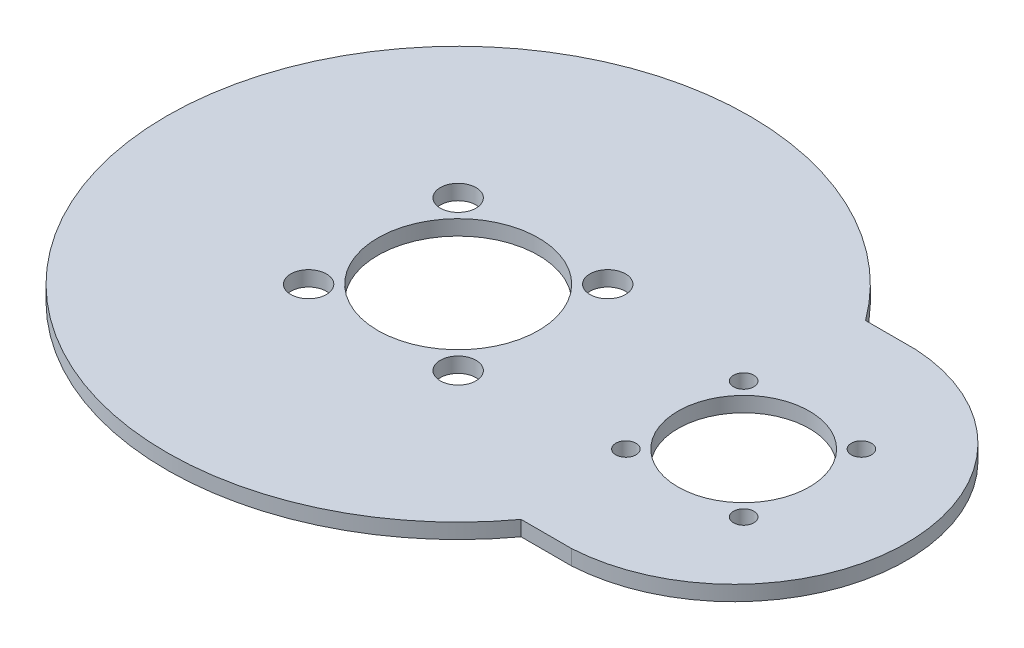
ISO-10303-21;
HEADER;
FILE_DESCRIPTION(('STEP AP214'),'2;1');
FILE_NAME('part.step','',(''),(''),'','','');
FILE_SCHEMA(('AUTOMOTIVE_DESIGN { 1 0 10303 214 1 1 1 1 }'));
ENDSEC;
DATA;
#1=APPLICATION_CONTEXT('core data for automotive mechanical design processes');
#2=APPLICATION_PROTOCOL_DEFINITION('international standard','automotive_design',2000,#1);
#3=PRODUCT_CONTEXT('',#1,'mechanical');
#4=PRODUCT('Part','Part','',(#3));
#5=PRODUCT_RELATED_PRODUCT_CATEGORY('part','',(#4));
#6=PRODUCT_DEFINITION_FORMATION('','',#4);
#7=PRODUCT_DEFINITION_CONTEXT('part definition',#1,'design');
#8=PRODUCT_DEFINITION('design','',#6,#7);
#9=PRODUCT_DEFINITION_SHAPE('','',#8);
#10=(LENGTH_UNIT() NAMED_UNIT(*) SI_UNIT(.MILLI.,.METRE.));
#11=(NAMED_UNIT(*) PLANE_ANGLE_UNIT() SI_UNIT($,.RADIAN.));
#12=(NAMED_UNIT(*) SI_UNIT($,.STERADIAN.) SOLID_ANGLE_UNIT());
#13=UNCERTAINTY_MEASURE_WITH_UNIT(LENGTH_MEASURE(1.E-05),#10,'distance_accuracy_value','');
#14=(GEOMETRIC_REPRESENTATION_CONTEXT(3) GLOBAL_UNCERTAINTY_ASSIGNED_CONTEXT((#13)) GLOBAL_UNIT_ASSIGNED_CONTEXT((#10,
#11,#12)) REPRESENTATION_CONTEXT('',''));
#15=CARTESIAN_POINT('',(0.,0.,0.));
#16=DIRECTION('',(0.,0.,1.));
#17=DIRECTION('',(1.,0.,0.));
#18=AXIS2_PLACEMENT_3D('',#15,#16,#17);
#19=CARTESIAN_POINT('',(0.,2.54,0.));
#20=DIRECTION('',(0.,-1.,0.));
#21=DIRECTION('',(0.,0.,-1.));
#22=AXIS2_PLACEMENT_3D('',#19,#20,#21);
#23=CYLINDRICAL_SURFACE('',#22,49.);
#24=CARTESIAN_POINT('',(0.,0.,0.));
#25=DIRECTION('',(0.,1.,0.));
#26=DIRECTION('',(0.,0.,1.));
#27=AXIS2_PLACEMENT_3D('',#24,#25,#26);
#28=CIRCLE('',#27,49.);
#29=CARTESIAN_POINT('',(39.5298227224412,0.,28.9550188314975));
#30=VERTEX_POINT('',#29);
#31=CARTESIAN_POINT('',(39.5298227224412,0.,-28.9550188314975));
#32=VERTEX_POINT('',#31);
#33=EDGE_CURVE('E135',#30,#32,#28,.F.);
#34=ORIENTED_EDGE('',*,*,#33,.F.);
#35=DIRECTION('',(0.,-1.,0.));
#36=VECTOR('',#35,1.);
#37=CARTESIAN_POINT('',(39.5298227224412,2.54,28.9550188314975));
#38=LINE('',#37,#36);
#39=CARTESIAN_POINT('',(39.5298227224412,2.54,28.9550188314975));
#40=VERTEX_POINT('',#39);
#41=EDGE_CURVE('E11',#40,#30,#38,.T.);
#42=ORIENTED_EDGE('',*,*,#41,.F.);
#43=CARTESIAN_POINT('',(0.,2.54,0.));
#44=DIRECTION('',(0.,1.,0.));
#45=DIRECTION('',(0.,0.,1.));
#46=AXIS2_PLACEMENT_3D('',#43,#44,#45);
#47=CIRCLE('',#46,49.);
#48=CARTESIAN_POINT('',(39.5298227224412,2.54,-28.9550188314975));
#49=VERTEX_POINT('',#48);
#50=EDGE_CURVE('E90',#40,#49,#47,.F.);
#51=ORIENTED_EDGE('',*,*,#50,.T.);
#52=DIRECTION('',(0.,-1.,0.));
#53=VECTOR('',#52,1.);
#54=CARTESIAN_POINT('',(39.5298227224412,2.54,-28.9550188314975));
#55=LINE('',#54,#53);
#56=EDGE_CURVE('E57',#49,#32,#55,.T.);
#57=ORIENTED_EDGE('',*,*,#56,.T.);
#58=EDGE_LOOP('',(#34,#42,#51,#57));
#59=FACE_BOUND('',#58,.T.);
#60=ADVANCED_FACE('F41',(#59),#23,.T.);
#61=CARTESIAN_POINT('',(0.,2.54,28.9550188314975));
#62=DIRECTION('',(0.,0.,-1.));
#63=DIRECTION('',(-1.,0.,0.));
#64=AXIS2_PLACEMENT_3D('',#61,#62,#63);
#65=PLANE('',#64);
#66=DIRECTION('',(1.,0.,0.));
#67=VECTOR('',#66,1.);
#68=CARTESIAN_POINT('',(0.,0.,28.9550188314975));
#69=LINE('',#68,#67);
#70=CARTESIAN_POINT('',(48.,0.,28.9550188314975));
#71=VERTEX_POINT('',#70);
#72=EDGE_CURVE('E96',#30,#71,#69,.T.);
#73=ORIENTED_EDGE('',*,*,#72,.T.);
#74=DIRECTION('',(0.,-1.,0.));
#75=VECTOR('',#74,1.);
#76=CARTESIAN_POINT('',(48.,2.54,28.9550188314975));
#77=LINE('',#76,#75);
#78=CARTESIAN_POINT('',(48.,2.54,28.9550188314975));
#79=VERTEX_POINT('',#78);
#80=EDGE_CURVE('E49',#79,#71,#77,.T.);
#81=ORIENTED_EDGE('',*,*,#80,.F.);
#82=DIRECTION('',(1.,0.,0.));
#83=VECTOR('',#82,1.);
#84=CARTESIAN_POINT('',(0.,2.54,28.9550188314975));
#85=LINE('',#84,#83);
#86=EDGE_CURVE('E83',#40,#79,#85,.T.);
#87=ORIENTED_EDGE('',*,*,#86,.F.);
#88=ORIENTED_EDGE('',*,*,#41,.T.);
#89=EDGE_LOOP('',(#73,#81,#87,#88));
#90=FACE_BOUND('',#89,.T.);
#91=ADVANCED_FACE('F94',(#90),#65,.F.);
#92=CARTESIAN_POINT('',(46.3854150788439,2.54,0.));
#93=DIRECTION('',(0.,-1.,0.));
#94=DIRECTION('',(0.,0.,-1.));
#95=AXIS2_PLACEMENT_3D('',#92,#93,#94);
#96=CYLINDRICAL_SURFACE('',#95,29.);
#97=CARTESIAN_POINT('',(46.3854150788439,0.,0.));
#98=DIRECTION('',(0.,1.,0.));
#99=DIRECTION('',(0.,0.,1.));
#100=AXIS2_PLACEMENT_3D('',#97,#98,#99);
#101=CIRCLE('',#100,29.);
#102=CARTESIAN_POINT('',(48.,0.,-28.9550188314975));
#103=VERTEX_POINT('',#102);
#104=EDGE_CURVE('E138',#103,#71,#101,.F.);
#105=ORIENTED_EDGE('',*,*,#104,.F.);
#106=DIRECTION('',(0.,-1.,0.));
#107=VECTOR('',#106,1.);
#108=CARTESIAN_POINT('',(48.,2.54,-28.9550188314975));
#109=LINE('',#108,#107);
#110=CARTESIAN_POINT('',(48.,2.54,-28.9550188314975));
#111=VERTEX_POINT('',#110);
#112=EDGE_CURVE('E70',#111,#103,#109,.T.);
#113=ORIENTED_EDGE('',*,*,#112,.F.);
#114=CARTESIAN_POINT('',(46.3854150788439,2.54,0.));
#115=DIRECTION('',(0.,1.,0.));
#116=DIRECTION('',(0.,0.,1.));
#117=AXIS2_PLACEMENT_3D('',#114,#115,#116);
#118=CIRCLE('',#117,29.);
#119=EDGE_CURVE('E89',#111,#79,#118,.F.);
#120=ORIENTED_EDGE('',*,*,#119,.T.);
#121=ORIENTED_EDGE('',*,*,#80,.T.);
#122=EDGE_LOOP('',(#105,#113,#120,#121));
#123=FACE_BOUND('',#122,.T.);
#124=ADVANCED_FACE('F99',(#123),#96,.T.);
#125=CARTESIAN_POINT('',(-12.5723585694968,2.54,-12.5723585694968));
#126=DIRECTION('',(0.,-1.,0.));
#127=DIRECTION('',(0.,0.,-1.));
#128=AXIS2_PLACEMENT_3D('',#125,#126,#127);
#129=CYLINDRICAL_SURFACE('',#128,3.);
#130=CARTESIAN_POINT('',(-12.5723585694968,2.54,-12.5723585694968));
#131=DIRECTION('',(0.,1.,0.));
#132=DIRECTION('',(0.,0.,1.));
#133=AXIS2_PLACEMENT_3D('',#130,#131,#132);
#134=CIRCLE('',#133,3.);
#135=CARTESIAN_POINT('',(-12.5723585694968,2.54,-9.57235856949679));
#136=VERTEX_POINT('',#135);
#137=EDGE_CURVE('E129',#136,#136,#134,.T.);
#138=ORIENTED_EDGE('',*,*,#137,.T.);
#139=EDGE_LOOP('',(#138));
#140=FACE_BOUND('',#139,.T.);
#141=CARTESIAN_POINT('',(-12.5723585694968,0.,-12.5723585694968));
#142=DIRECTION('',(0.,1.,0.));
#143=DIRECTION('',(0.,0.,1.));
#144=AXIS2_PLACEMENT_3D('',#141,#142,#143);
#145=CIRCLE('',#144,3.);
#146=CARTESIAN_POINT('',(-12.5723585694968,0.,-9.57235856949679));
#147=VERTEX_POINT('',#146);
#148=EDGE_CURVE('E167',#147,#147,#145,.T.);
#149=ORIENTED_EDGE('',*,*,#148,.F.);
#150=EDGE_LOOP('',(#149));
#151=FACE_BOUND('',#150,.T.);
#152=ADVANCED_FACE('F198',(#140,#151),#129,.F.);
#153=CARTESIAN_POINT('',(12.5723585694968,2.54,-12.5723585694968));
#154=DIRECTION('',(0.,-1.,0.));
#155=DIRECTION('',(0.,0.,-1.));
#156=AXIS2_PLACEMENT_3D('',#153,#154,#155);
#157=CYLINDRICAL_SURFACE('',#156,3.);
#158=CARTESIAN_POINT('',(12.5723585694968,2.54,-12.5723585694968));
#159=DIRECTION('',(0.,1.,0.));
#160=DIRECTION('',(0.,0.,1.));
#161=AXIS2_PLACEMENT_3D('',#158,#159,#160);
#162=CIRCLE('',#161,3.);
#163=CARTESIAN_POINT('',(12.5723585694968,2.54,-9.57235856949679));
#164=VERTEX_POINT('',#163);
#165=EDGE_CURVE('E126',#164,#164,#162,.T.);
#166=ORIENTED_EDGE('',*,*,#165,.T.);
#167=EDGE_LOOP('',(#166));
#168=FACE_BOUND('',#167,.T.);
#169=CARTESIAN_POINT('',(12.5723585694968,0.,-12.5723585694968));
#170=DIRECTION('',(0.,1.,0.));
#171=DIRECTION('',(0.,0.,1.));
#172=AXIS2_PLACEMENT_3D('',#169,#170,#171);
#173=CIRCLE('',#172,3.);
#174=CARTESIAN_POINT('',(12.5723585694968,0.,-9.57235856949679));
#175=VERTEX_POINT('',#174);
#176=EDGE_CURVE('E164',#175,#175,#173,.T.);
#177=ORIENTED_EDGE('',*,*,#176,.F.);
#178=EDGE_LOOP('',(#177));
#179=FACE_BOUND('',#178,.T.);
#180=ADVANCED_FACE('F202',(#168,#179),#157,.F.);
#181=CARTESIAN_POINT('',(12.5723585694967,2.54,12.5723585694969));
#182=DIRECTION('',(0.,-1.,0.));
#183=DIRECTION('',(0.,0.,-1.));
#184=AXIS2_PLACEMENT_3D('',#181,#182,#183);
#185=CYLINDRICAL_SURFACE('',#184,3.);
#186=CARTESIAN_POINT('',(12.5723585694967,2.54,12.5723585694969));
#187=DIRECTION('',(0.,1.,0.));
#188=DIRECTION('',(0.,0.,1.));
#189=AXIS2_PLACEMENT_3D('',#186,#187,#188);
#190=CIRCLE('',#189,3.);
#191=CARTESIAN_POINT('',(12.5723585694967,2.54,15.5723585694969));
#192=VERTEX_POINT('',#191);
#193=EDGE_CURVE('E123',#192,#192,#190,.T.);
#194=ORIENTED_EDGE('',*,*,#193,.T.);
#195=EDGE_LOOP('',(#194));
#196=FACE_BOUND('',#195,.T.);
#197=CARTESIAN_POINT('',(12.5723585694967,0.,12.5723585694969));
#198=DIRECTION('',(0.,1.,0.));
#199=DIRECTION('',(0.,0.,1.));
#200=AXIS2_PLACEMENT_3D('',#197,#198,#199);
#201=CIRCLE('',#200,3.);
#202=CARTESIAN_POINT('',(12.5723585694967,0.,15.5723585694969));
#203=VERTEX_POINT('',#202);
#204=EDGE_CURVE('E161',#203,#203,#201,.T.);
#205=ORIENTED_EDGE('',*,*,#204,.F.);
#206=EDGE_LOOP('',(#205));
#207=FACE_BOUND('',#206,.T.);
#208=ADVANCED_FACE('F208',(#196,#207),#185,.F.);
#209=CARTESIAN_POINT('',(-12.5723585694969,2.54,12.5723585694967));
#210=DIRECTION('',(0.,-1.,0.));
#211=DIRECTION('',(0.,0.,-1.));
#212=AXIS2_PLACEMENT_3D('',#209,#210,#211);
#213=CYLINDRICAL_SURFACE('',#212,3.);
#214=CARTESIAN_POINT('',(-12.5723585694969,2.54,12.5723585694967));
#215=DIRECTION('',(0.,1.,0.));
#216=DIRECTION('',(0.,0.,1.));
#217=AXIS2_PLACEMENT_3D('',#214,#215,#216);
#218=CIRCLE('',#217,3.);
#219=CARTESIAN_POINT('',(-12.5723585694969,2.54,15.5723585694967));
#220=VERTEX_POINT('',#219);
#221=EDGE_CURVE('E120',#220,#220,#218,.T.);
#222=ORIENTED_EDGE('',*,*,#221,.T.);
#223=EDGE_LOOP('',(#222));
#224=FACE_BOUND('',#223,.T.);
#225=CARTESIAN_POINT('',(-12.5723585694969,0.,12.5723585694967));
#226=DIRECTION('',(0.,1.,0.));
#227=DIRECTION('',(0.,0.,1.));
#228=AXIS2_PLACEMENT_3D('',#225,#226,#227);
#229=CIRCLE('',#228,3.);
#230=CARTESIAN_POINT('',(-12.5723585694969,0.,15.5723585694967));
#231=VERTEX_POINT('',#230);
#232=EDGE_CURVE('E158',#231,#231,#229,.T.);
#233=ORIENTED_EDGE('',*,*,#232,.F.);
#234=EDGE_LOOP('',(#233));
#235=FACE_BOUND('',#234,.T.);
#236=ADVANCED_FACE('F216',(#224,#235),#213,.F.);
#237=CARTESIAN_POINT('',(0.,2.54,0.));
#238=DIRECTION('',(0.,-1.,0.));
#239=DIRECTION('',(0.,0.,-1.));
#240=AXIS2_PLACEMENT_3D('',#237,#238,#239);
#241=CYLINDRICAL_SURFACE('',#240,13.5);
#242=CARTESIAN_POINT('',(0.,2.54,0.));
#243=DIRECTION('',(0.,1.,0.));
#244=DIRECTION('',(0.,0.,1.));
#245=AXIS2_PLACEMENT_3D('',#242,#243,#244);
#246=CIRCLE('',#245,13.5);
#247=CARTESIAN_POINT('',(0.,2.54,13.5));
#248=VERTEX_POINT('',#247);
#249=EDGE_CURVE('E117',#248,#248,#246,.T.);
#250=ORIENTED_EDGE('',*,*,#249,.T.);
#251=EDGE_LOOP('',(#250));
#252=FACE_BOUND('',#251,.T.);
#253=CARTESIAN_POINT('',(0.,0.,0.));
#254=DIRECTION('',(0.,1.,0.));
#255=DIRECTION('',(0.,0.,1.));
#256=AXIS2_PLACEMENT_3D('',#253,#254,#255);
#257=CIRCLE('',#256,13.5);
#258=CARTESIAN_POINT('',(0.,0.,13.5));
#259=VERTEX_POINT('',#258);
#260=EDGE_CURVE('E155',#259,#259,#257,.T.);
#261=ORIENTED_EDGE('',*,*,#260,.F.);
#262=EDGE_LOOP('',(#261));
#263=FACE_BOUND('',#262,.T.);
#264=ADVANCED_FACE('F220',(#252,#263),#241,.F.);
#265=CARTESIAN_POINT('',(38.1005050633883,2.54,-9.89949493661165));
#266=DIRECTION('',(0.,-1.,0.));
#267=DIRECTION('',(0.,0.,-1.));
#268=AXIS2_PLACEMENT_3D('',#265,#266,#267);
#269=CYLINDRICAL_SURFACE('',#268,1.7);
#270=CARTESIAN_POINT('',(38.1005050633883,2.54,-9.89949493661165));
#271=DIRECTION('',(0.,1.,0.));
#272=DIRECTION('',(0.,0.,1.));
#273=AXIS2_PLACEMENT_3D('',#270,#271,#272);
#274=CIRCLE('',#273,1.7);
#275=CARTESIAN_POINT('',(38.1005050633883,2.54,-8.19949493661165));
#276=VERTEX_POINT('',#275);
#277=EDGE_CURVE('E114',#276,#276,#274,.T.);
#278=ORIENTED_EDGE('',*,*,#277,.T.);
#279=EDGE_LOOP('',(#278));
#280=FACE_BOUND('',#279,.T.);
#281=CARTESIAN_POINT('',(38.1005050633883,0.,-9.89949493661165));
#282=DIRECTION('',(0.,1.,0.));
#283=DIRECTION('',(0.,0.,1.));
#284=AXIS2_PLACEMENT_3D('',#281,#282,#283);
#285=CIRCLE('',#284,1.7);
#286=CARTESIAN_POINT('',(38.1005050633883,0.,-8.19949493661165));
#287=VERTEX_POINT('',#286);
#288=EDGE_CURVE('E152',#287,#287,#285,.T.);
#289=ORIENTED_EDGE('',*,*,#288,.F.);
#290=EDGE_LOOP('',(#289));
#291=FACE_BOUND('',#290,.T.);
#292=ADVANCED_FACE('F224',(#280,#291),#269,.F.);
#293=CARTESIAN_POINT('',(57.8994949366117,2.54,-9.89949493661192));
#294=DIRECTION('',(0.,-1.,0.));
#295=DIRECTION('',(0.,0.,-1.));
#296=AXIS2_PLACEMENT_3D('',#293,#294,#295);
#297=CYLINDRICAL_SURFACE('',#296,1.7);
#298=CARTESIAN_POINT('',(57.8994949366117,2.54,-9.89949493661192));
#299=DIRECTION('',(0.,1.,0.));
#300=DIRECTION('',(0.,0.,1.));
#301=AXIS2_PLACEMENT_3D('',#298,#299,#300);
#302=CIRCLE('',#301,1.7);
#303=CARTESIAN_POINT('',(57.8994949366117,2.54,-8.19949493661193));
#304=VERTEX_POINT('',#303);
#305=EDGE_CURVE('E111',#304,#304,#302,.T.);
#306=ORIENTED_EDGE('',*,*,#305,.T.);
#307=EDGE_LOOP('',(#306));
#308=FACE_BOUND('',#307,.T.);
#309=CARTESIAN_POINT('',(57.8994949366117,0.,-9.89949493661192));
#310=DIRECTION('',(0.,1.,0.));
#311=DIRECTION('',(0.,0.,1.));
#312=AXIS2_PLACEMENT_3D('',#309,#310,#311);
#313=CIRCLE('',#312,1.7);
#314=CARTESIAN_POINT('',(57.8994949366117,0.,-8.19949493661193));
#315=VERTEX_POINT('',#314);
#316=EDGE_CURVE('E149',#315,#315,#313,.T.);
#317=ORIENTED_EDGE('',*,*,#316,.F.);
#318=EDGE_LOOP('',(#317));
#319=FACE_BOUND('',#318,.T.);
#320=ADVANCED_FACE('F228',(#308,#319),#297,.F.);
#321=CARTESIAN_POINT('',(57.8994949366119,2.54,9.89949493661144));
#322=DIRECTION('',(0.,-1.,0.));
#323=DIRECTION('',(0.,0.,-1.));
#324=AXIS2_PLACEMENT_3D('',#321,#322,#323);
#325=CYLINDRICAL_SURFACE('',#324,1.7);
#326=CARTESIAN_POINT('',(57.8994949366119,2.54,9.89949493661144));
#327=DIRECTION('',(0.,1.,0.));
#328=DIRECTION('',(0.,0.,1.));
#329=AXIS2_PLACEMENT_3D('',#326,#327,#328);
#330=CIRCLE('',#329,1.7);
#331=CARTESIAN_POINT('',(57.8994949366119,2.54,11.5994949366114));
#332=VERTEX_POINT('',#331);
#333=EDGE_CURVE('E108',#332,#332,#330,.T.);
#334=ORIENTED_EDGE('',*,*,#333,.T.);
#335=EDGE_LOOP('',(#334));
#336=FACE_BOUND('',#335,.T.);
#337=CARTESIAN_POINT('',(57.8994949366119,0.,9.89949493661144));
#338=DIRECTION('',(0.,1.,0.));
#339=DIRECTION('',(0.,0.,1.));
#340=AXIS2_PLACEMENT_3D('',#337,#338,#339);
#341=CIRCLE('',#340,1.7);
#342=CARTESIAN_POINT('',(57.8994949366119,0.,11.5994949366114));
#343=VERTEX_POINT('',#342);
#344=EDGE_CURVE('E146',#343,#343,#341,.T.);
#345=ORIENTED_EDGE('',*,*,#344,.F.);
#346=EDGE_LOOP('',(#345));
#347=FACE_BOUND('',#346,.T.);
#348=ADVANCED_FACE('F187',(#336,#347),#325,.F.);
#349=CARTESIAN_POINT('',(38.1005050633885,2.54,9.89949493661158));
#350=DIRECTION('',(0.,-1.,0.));
#351=DIRECTION('',(0.,0.,-1.));
#352=AXIS2_PLACEMENT_3D('',#349,#350,#351);
#353=CYLINDRICAL_SURFACE('',#352,1.7);
#354=CARTESIAN_POINT('',(38.1005050633885,2.54,9.89949493661158));
#355=DIRECTION('',(0.,1.,0.));
#356=DIRECTION('',(0.,0.,1.));
#357=AXIS2_PLACEMENT_3D('',#354,#355,#356);
#358=CIRCLE('',#357,1.7);
#359=CARTESIAN_POINT('',(38.1005050633885,2.54,11.5994949366116));
#360=VERTEX_POINT('',#359);
#361=EDGE_CURVE('E102',#360,#360,#358,.T.);
#362=ORIENTED_EDGE('',*,*,#361,.T.);
#363=EDGE_LOOP('',(#362));
#364=FACE_BOUND('',#363,.T.);
#365=CARTESIAN_POINT('',(38.1005050633885,0.,9.89949493661158));
#366=DIRECTION('',(0.,1.,0.));
#367=DIRECTION('',(0.,0.,1.));
#368=AXIS2_PLACEMENT_3D('',#365,#366,#367);
#369=CIRCLE('',#368,1.7);
#370=CARTESIAN_POINT('',(38.1005050633885,0.,11.5994949366116));
#371=VERTEX_POINT('',#370);
#372=EDGE_CURVE('E143',#371,#371,#369,.T.);
#373=ORIENTED_EDGE('',*,*,#372,.F.);
#374=EDGE_LOOP('',(#373));
#375=FACE_BOUND('',#374,.T.);
#376=ADVANCED_FACE('F179',(#364,#375),#353,.F.);
#377=CARTESIAN_POINT('',(0.,2.54,-28.9550188314975));
#378=DIRECTION('',(0.,0.,-1.));
#379=DIRECTION('',(-1.,0.,0.));
#380=AXIS2_PLACEMENT_3D('',#377,#378,#379);
#381=PLANE('',#380);
#382=DIRECTION('',(1.,0.,0.));
#383=VECTOR('',#382,1.);
#384=CARTESIAN_POINT('',(0.,0.,-28.9550188314975));
#385=LINE('',#384,#383);
#386=EDGE_CURVE('E140',#32,#103,#385,.T.);
#387=ORIENTED_EDGE('',*,*,#386,.F.);
#388=ORIENTED_EDGE('',*,*,#56,.F.);
#389=DIRECTION('',(1.,0.,0.));
#390=VECTOR('',#389,1.);
#391=CARTESIAN_POINT('',(0.,2.54,-28.9550188314975));
#392=LINE('',#391,#390);
#393=EDGE_CURVE('E100',#49,#111,#392,.T.);
#394=ORIENTED_EDGE('',*,*,#393,.T.);
#395=ORIENTED_EDGE('',*,*,#112,.T.);
#396=EDGE_LOOP('',(#387,#388,#394,#395));
#397=FACE_BOUND('',#396,.T.);
#398=ADVANCED_FACE('F176',(#397),#381,.T.);
#399=CARTESIAN_POINT('',(48.,2.54,0.));
#400=DIRECTION('',(0.,-1.,0.));
#401=DIRECTION('',(0.,0.,-1.));
#402=AXIS2_PLACEMENT_3D('',#399,#400,#401);
#403=CYLINDRICAL_SURFACE('',#402,11.05);
#404=CARTESIAN_POINT('',(48.,2.54,0.));
#405=DIRECTION('',(0.,1.,0.));
#406=DIRECTION('',(0.,0.,1.));
#407=AXIS2_PLACEMENT_3D('',#404,#405,#406);
#408=CIRCLE('',#407,11.05);
#409=CARTESIAN_POINT('',(48.,2.54,11.05));
#410=VERTEX_POINT('',#409);
#411=EDGE_CURVE('E132',#410,#410,#408,.T.);
#412=ORIENTED_EDGE('',*,*,#411,.T.);
#413=EDGE_LOOP('',(#412));
#414=FACE_BOUND('',#413,.T.);
#415=CARTESIAN_POINT('',(48.,0.,0.));
#416=DIRECTION('',(0.,1.,0.));
#417=DIRECTION('',(0.,0.,1.));
#418=AXIS2_PLACEMENT_3D('',#415,#416,#417);
#419=CIRCLE('',#418,11.05);
#420=CARTESIAN_POINT('',(48.,0.,11.05));
#421=VERTEX_POINT('',#420);
#422=EDGE_CURVE('E170',#421,#421,#419,.T.);
#423=ORIENTED_EDGE('',*,*,#422,.F.);
#424=EDGE_LOOP('',(#423));
#425=FACE_BOUND('',#424,.T.);
#426=ADVANCED_FACE('F178',(#414,#425),#403,.F.);
#427=CARTESIAN_POINT('',(0.,2.54,0.));
#428=DIRECTION('',(0.,1.,0.));
#429=DIRECTION('',(0.,0.,1.));
#430=AXIS2_PLACEMENT_3D('',#427,#428,#429);
#431=PLANE('',#430);
#432=ORIENTED_EDGE('',*,*,#50,.F.);
#433=ORIENTED_EDGE('',*,*,#86,.T.);
#434=ORIENTED_EDGE('',*,*,#119,.F.);
#435=ORIENTED_EDGE('',*,*,#393,.F.);
#436=EDGE_LOOP('',(#432,#433,#434,#435));
#437=FACE_BOUND('',#436,.T.);
#438=ORIENTED_EDGE('',*,*,#361,.F.);
#439=EDGE_LOOP('',(#438));
#440=FACE_BOUND('',#439,.T.);
#441=ORIENTED_EDGE('',*,*,#333,.F.);
#442=EDGE_LOOP('',(#441));
#443=FACE_BOUND('',#442,.T.);
#444=ORIENTED_EDGE('',*,*,#305,.F.);
#445=EDGE_LOOP('',(#444));
#446=FACE_BOUND('',#445,.T.);
#447=ORIENTED_EDGE('',*,*,#277,.F.);
#448=EDGE_LOOP('',(#447));
#449=FACE_BOUND('',#448,.T.);
#450=ORIENTED_EDGE('',*,*,#249,.F.);
#451=EDGE_LOOP('',(#450));
#452=FACE_BOUND('',#451,.T.);
#453=ORIENTED_EDGE('',*,*,#221,.F.);
#454=EDGE_LOOP('',(#453));
#455=FACE_BOUND('',#454,.T.);
#456=ORIENTED_EDGE('',*,*,#193,.F.);
#457=EDGE_LOOP('',(#456));
#458=FACE_BOUND('',#457,.T.);
#459=ORIENTED_EDGE('',*,*,#165,.F.);
#460=EDGE_LOOP('',(#459));
#461=FACE_BOUND('',#460,.T.);
#462=ORIENTED_EDGE('',*,*,#137,.F.);
#463=EDGE_LOOP('',(#462));
#464=FACE_BOUND('',#463,.T.);
#465=ORIENTED_EDGE('',*,*,#411,.F.);
#466=EDGE_LOOP('',(#465));
#467=FACE_BOUND('',#466,.T.);
#468=ADVANCED_FACE('F85',(#437,#440,#443,#446,#449,#452,#455,#458,#461,#464,#467),#431,.T.);
#469=CARTESIAN_POINT('',(0.,0.,0.));
#470=DIRECTION('',(0.,1.,0.));
#471=DIRECTION('',(0.,0.,1.));
#472=AXIS2_PLACEMENT_3D('',#469,#470,#471);
#473=PLANE('',#472);
#474=ORIENTED_EDGE('',*,*,#33,.T.);
#475=ORIENTED_EDGE('',*,*,#386,.T.);
#476=ORIENTED_EDGE('',*,*,#104,.T.);
#477=ORIENTED_EDGE('',*,*,#72,.F.);
#478=EDGE_LOOP('',(#474,#475,#476,#477));
#479=FACE_BOUND('',#478,.T.);
#480=ORIENTED_EDGE('',*,*,#372,.T.);
#481=EDGE_LOOP('',(#480));
#482=FACE_BOUND('',#481,.T.);
#483=ORIENTED_EDGE('',*,*,#344,.T.);
#484=EDGE_LOOP('',(#483));
#485=FACE_BOUND('',#484,.T.);
#486=ORIENTED_EDGE('',*,*,#316,.T.);
#487=EDGE_LOOP('',(#486));
#488=FACE_BOUND('',#487,.T.);
#489=ORIENTED_EDGE('',*,*,#288,.T.);
#490=EDGE_LOOP('',(#489));
#491=FACE_BOUND('',#490,.T.);
#492=ORIENTED_EDGE('',*,*,#260,.T.);
#493=EDGE_LOOP('',(#492));
#494=FACE_BOUND('',#493,.T.);
#495=ORIENTED_EDGE('',*,*,#232,.T.);
#496=EDGE_LOOP('',(#495));
#497=FACE_BOUND('',#496,.T.);
#498=ORIENTED_EDGE('',*,*,#204,.T.);
#499=EDGE_LOOP('',(#498));
#500=FACE_BOUND('',#499,.T.);
#501=ORIENTED_EDGE('',*,*,#176,.T.);
#502=EDGE_LOOP('',(#501));
#503=FACE_BOUND('',#502,.T.);
#504=ORIENTED_EDGE('',*,*,#148,.T.);
#505=EDGE_LOOP('',(#504));
#506=FACE_BOUND('',#505,.T.);
#507=ORIENTED_EDGE('',*,*,#422,.T.);
#508=EDGE_LOOP('',(#507));
#509=FACE_BOUND('',#508,.T.);
#510=ADVANCED_FACE('F241',(#479,#482,#485,#488,#491,#494,#497,#500,#503,#506,#509),#473,.F.);
#511=CLOSED_SHELL('',(#60,#91,#124,#152,#180,#208,#236,#264,#292,#320,#348,#376,#398,#426,#468,#510));
#512=MANIFOLD_SOLID_BREP('B2',#511);
#513=ADVANCED_BREP_SHAPE_REPRESENTATION('',(#18,#512),#14);
#514=SHAPE_DEFINITION_REPRESENTATION(#9,#513);
ENDSEC;
END-ISO-10303-21;
